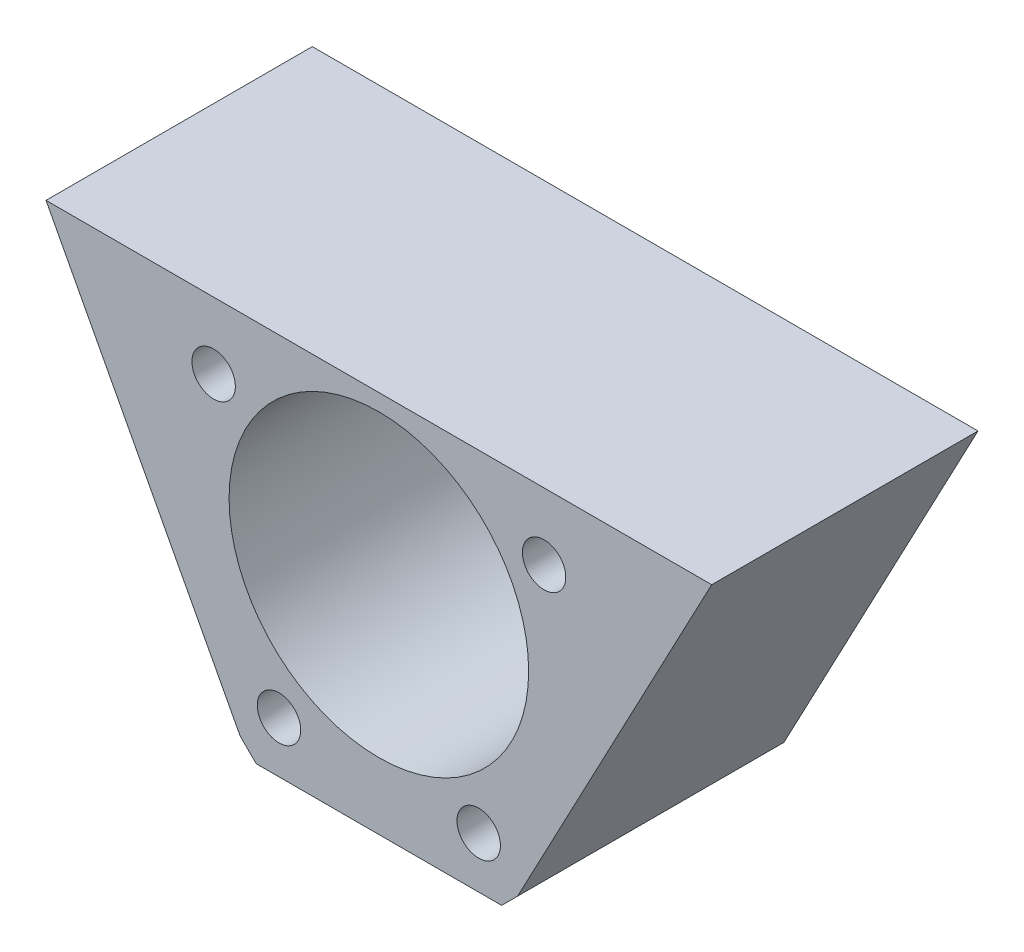
ISO-10303-21;
HEADER;
FILE_DESCRIPTION(('STEP AP214'),'2;1');
FILE_NAME('part.step','',(''),(''),'','','');
FILE_SCHEMA(('AUTOMOTIVE_DESIGN { 1 0 10303 214 1 1 1 1 }'));
ENDSEC;
DATA;
#1=APPLICATION_CONTEXT('core data for automotive mechanical design processes');
#2=APPLICATION_PROTOCOL_DEFINITION('international standard','automotive_design',2000,#1);
#3=PRODUCT_CONTEXT('',#1,'mechanical');
#4=PRODUCT('Part','Part','',(#3));
#5=PRODUCT_RELATED_PRODUCT_CATEGORY('part','',(#4));
#6=PRODUCT_DEFINITION_FORMATION('','',#4);
#7=PRODUCT_DEFINITION_CONTEXT('part definition',#1,'design');
#8=PRODUCT_DEFINITION('design','',#6,#7);
#9=PRODUCT_DEFINITION_SHAPE('','',#8);
#10=(LENGTH_UNIT() NAMED_UNIT(*) SI_UNIT(.MILLI.,.METRE.));
#11=(NAMED_UNIT(*) PLANE_ANGLE_UNIT() SI_UNIT($,.RADIAN.));
#12=(NAMED_UNIT(*) SI_UNIT($,.STERADIAN.) SOLID_ANGLE_UNIT());
#13=UNCERTAINTY_MEASURE_WITH_UNIT(LENGTH_MEASURE(1.E-05),#10,'distance_accuracy_value','');
#14=(GEOMETRIC_REPRESENTATION_CONTEXT(3) GLOBAL_UNCERTAINTY_ASSIGNED_CONTEXT((#13)) GLOBAL_UNIT_ASSIGNED_CONTEXT((#10,
#11,#12)) REPRESENTATION_CONTEXT('',''));
#15=CARTESIAN_POINT('',(0.,0.,0.));
#16=DIRECTION('',(0.,0.,1.));
#17=DIRECTION('',(1.,0.,0.));
#18=AXIS2_PLACEMENT_3D('',#15,#16,#17);
#19=CARTESIAN_POINT('',(-31.75,15.875,25.4));
#20=DIRECTION('',(0.883868107973205,0.46773621594641,0.));
#21=DIRECTION('',(-0.46773621594641,0.883868107973205,0.));
#22=AXIS2_PLACEMENT_3D('',#19,#20,#21);
#23=PLANE('',#22);
#24=DIRECTION('',(0.46773621594641,-0.883868107973205,0.));
#25=VECTOR('',#24,1.);
#26=CARTESIAN_POINT('',(-31.75,15.875,0.));
#27=LINE('',#26,#25);
#28=CARTESIAN_POINT('',(-31.75,15.875,0.));
#29=VERTEX_POINT('',#28);
#30=CARTESIAN_POINT('',(-13.2357534010395,-19.1108564594183,0.));
#31=VERTEX_POINT('',#30);
#32=EDGE_CURVE('E132',#29,#31,#27,.T.);
#33=ORIENTED_EDGE('',*,*,#32,.T.);
#34=DIRECTION('',(0.,0.,-1.));
#35=VECTOR('',#34,1.);
#36=CARTESIAN_POINT('',(-13.2357534010395,-19.1108564594183,25.4));
#37=LINE('',#36,#35);
#38=CARTESIAN_POINT('',(-13.2357534010395,-19.1108564594183,25.4));
#39=VERTEX_POINT('',#38);
#40=EDGE_CURVE('E11',#39,#31,#37,.T.);
#41=ORIENTED_EDGE('',*,*,#40,.F.);
#42=DIRECTION('',(0.46773621594641,-0.883868107973205,0.));
#43=VECTOR('',#42,1.);
#44=CARTESIAN_POINT('',(-31.75,15.875,25.4));
#45=LINE('',#44,#43);
#46=CARTESIAN_POINT('',(-31.75,15.875,25.4));
#47=VERTEX_POINT('',#46);
#48=EDGE_CURVE('E149',#47,#39,#45,.T.);
#49=ORIENTED_EDGE('',*,*,#48,.F.);
#50=DIRECTION('',(0.,0.,-1.));
#51=VECTOR('',#50,1.);
#52=CARTESIAN_POINT('',(-31.75,15.875,25.4));
#53=LINE('',#52,#51);
#54=EDGE_CURVE('E128',#47,#29,#53,.T.);
#55=ORIENTED_EDGE('',*,*,#54,.T.);
#56=EDGE_LOOP('',(#33,#41,#49,#55));
#57=FACE_BOUND('',#56,.T.);
#58=ADVANCED_FACE('F43',(#57),#23,.F.);
#59=CARTESIAN_POINT('',(-13.2357534010395,-19.1108564594183,25.4));
#60=DIRECTION('',(0.707106781186545,0.70710678118655,0.));
#61=DIRECTION('',(-0.70710678118655,0.707106781186545,0.));
#62=AXIS2_PLACEMENT_3D('',#59,#60,#61);
#63=PLANE('',#62);
#64=DIRECTION('',(0.70710678118655,-0.707106781186545,0.));
#65=VECTOR('',#64,1.);
#66=CARTESIAN_POINT('',(-13.2357534010395,-19.1108564594183,0.));
#67=LINE('',#66,#65);
#68=CARTESIAN_POINT('',(-11.7091098604577,-20.6375,0.));
#69=VERTEX_POINT('',#68);
#70=EDGE_CURVE('E136',#31,#69,#67,.T.);
#71=ORIENTED_EDGE('',*,*,#70,.T.);
#72=DIRECTION('',(0.,0.,-1.));
#73=VECTOR('',#72,1.);
#74=CARTESIAN_POINT('',(-11.7091098604577,-20.6375,25.4));
#75=LINE('',#74,#73);
#76=CARTESIAN_POINT('',(-11.7091098604577,-20.6375,25.4));
#77=VERTEX_POINT('',#76);
#78=EDGE_CURVE('E52',#77,#69,#75,.T.);
#79=ORIENTED_EDGE('',*,*,#78,.F.);
#80=DIRECTION('',(0.70710678118655,-0.707106781186545,0.));
#81=VECTOR('',#80,1.);
#82=CARTESIAN_POINT('',(-13.2357534010395,-19.1108564594183,25.4));
#83=LINE('',#82,#81);
#84=EDGE_CURVE('E97',#39,#77,#83,.T.);
#85=ORIENTED_EDGE('',*,*,#84,.F.);
#86=ORIENTED_EDGE('',*,*,#40,.T.);
#87=EDGE_LOOP('',(#71,#79,#85,#86));
#88=FACE_BOUND('',#87,.T.);
#89=ADVANCED_FACE('F178',(#88),#63,.F.);
#90=CARTESIAN_POINT('',(-11.7091098604577,-20.6375,25.4));
#91=DIRECTION('',(0.,1.,0.));
#92=DIRECTION('',(0.,0.,1.));
#93=AXIS2_PLACEMENT_3D('',#90,#91,#92);
#94=PLANE('',#93);
#95=DIRECTION('',(1.,0.,0.));
#96=VECTOR('',#95,1.);
#97=CARTESIAN_POINT('',(-11.7091098604577,-20.6375,0.));
#98=LINE('',#97,#96);
#99=CARTESIAN_POINT('',(11.7091098604578,-20.6375,0.));
#100=VERTEX_POINT('',#99);
#101=EDGE_CURVE('E140',#69,#100,#98,.T.);
#102=ORIENTED_EDGE('',*,*,#101,.T.);
#103=DIRECTION('',(0.,0.,-1.));
#104=VECTOR('',#103,1.);
#105=CARTESIAN_POINT('',(11.7091098604578,-20.6375,25.4));
#106=LINE('',#105,#104);
#107=CARTESIAN_POINT('',(11.7091098604578,-20.6375,25.4));
#108=VERTEX_POINT('',#107);
#109=EDGE_CURVE('E121',#108,#100,#106,.T.);
#110=ORIENTED_EDGE('',*,*,#109,.F.);
#111=DIRECTION('',(1.,0.,0.));
#112=VECTOR('',#111,1.);
#113=CARTESIAN_POINT('',(-11.7091098604577,-20.6375,25.4));
#114=LINE('',#113,#112);
#115=EDGE_CURVE('E110',#77,#108,#114,.T.);
#116=ORIENTED_EDGE('',*,*,#115,.F.);
#117=ORIENTED_EDGE('',*,*,#78,.T.);
#118=EDGE_LOOP('',(#102,#110,#116,#117));
#119=FACE_BOUND('',#118,.T.);
#120=ADVANCED_FACE('F159',(#119),#94,.F.);
#121=CARTESIAN_POINT('',(11.7091098604578,-20.6375,25.4));
#122=DIRECTION('',(-0.707106781186545,0.70710678118655,0.));
#123=DIRECTION('',(-0.70710678118655,-0.707106781186545,0.));
#124=AXIS2_PLACEMENT_3D('',#121,#122,#123);
#125=PLANE('',#124);
#126=DIRECTION('',(0.70710678118655,0.707106781186545,0.));
#127=VECTOR('',#126,1.);
#128=CARTESIAN_POINT('',(11.7091098604578,-20.6375,0.));
#129=LINE('',#128,#127);
#130=CARTESIAN_POINT('',(13.2357534010395,-19.1108564594183,0.));
#131=VERTEX_POINT('',#130);
#132=EDGE_CURVE('E119',#100,#131,#129,.T.);
#133=ORIENTED_EDGE('',*,*,#132,.T.);
#134=DIRECTION('',(0.,0.,-1.));
#135=VECTOR('',#134,1.);
#136=CARTESIAN_POINT('',(13.2357534010395,-19.1108564594183,25.4));
#137=LINE('',#136,#135);
#138=CARTESIAN_POINT('',(13.2357534010395,-19.1108564594183,25.4));
#139=VERTEX_POINT('',#138);
#140=EDGE_CURVE('E116',#139,#131,#137,.T.);
#141=ORIENTED_EDGE('',*,*,#140,.F.);
#142=DIRECTION('',(0.70710678118655,0.707106781186545,0.));
#143=VECTOR('',#142,1.);
#144=CARTESIAN_POINT('',(11.7091098604578,-20.6375,25.4));
#145=LINE('',#144,#143);
#146=EDGE_CURVE('E104',#108,#139,#145,.T.);
#147=ORIENTED_EDGE('',*,*,#146,.F.);
#148=ORIENTED_EDGE('',*,*,#109,.T.);
#149=EDGE_LOOP('',(#133,#141,#147,#148));
#150=FACE_BOUND('',#149,.T.);
#151=ADVANCED_FACE('F117',(#150),#125,.F.);
#152=CARTESIAN_POINT('',(13.2357534010395,-19.1108564594183,25.4));
#153=DIRECTION('',(-0.883868107973205,0.46773621594641,0.));
#154=DIRECTION('',(-0.46773621594641,-0.883868107973205,0.));
#155=AXIS2_PLACEMENT_3D('',#152,#153,#154);
#156=PLANE('',#155);
#157=DIRECTION('',(0.46773621594641,0.883868107973205,0.));
#158=VECTOR('',#157,1.);
#159=CARTESIAN_POINT('',(13.2357534010395,-19.1108564594183,0.));
#160=LINE('',#159,#158);
#161=CARTESIAN_POINT('',(31.75,15.875,0.));
#162=VERTEX_POINT('',#161);
#163=EDGE_CURVE('E83',#131,#162,#160,.T.);
#164=ORIENTED_EDGE('',*,*,#163,.T.);
#165=DIRECTION('',(0.,0.,-1.));
#166=VECTOR('',#165,1.);
#167=CARTESIAN_POINT('',(31.75,15.875,25.4));
#168=LINE('',#167,#166);
#169=CARTESIAN_POINT('',(31.75,15.875,25.4));
#170=VERTEX_POINT('',#169);
#171=EDGE_CURVE('E122',#170,#162,#168,.T.);
#172=ORIENTED_EDGE('',*,*,#171,.F.);
#173=DIRECTION('',(0.46773621594641,0.883868107973205,0.));
#174=VECTOR('',#173,1.);
#175=CARTESIAN_POINT('',(13.2357534010395,-19.1108564594183,25.4));
#176=LINE('',#175,#174);
#177=EDGE_CURVE('E108',#139,#170,#176,.T.);
#178=ORIENTED_EDGE('',*,*,#177,.F.);
#179=ORIENTED_EDGE('',*,*,#140,.T.);
#180=EDGE_LOOP('',(#164,#172,#178,#179));
#181=FACE_BOUND('',#180,.T.);
#182=ADVANCED_FACE('F124',(#181),#156,.F.);
#183=CARTESIAN_POINT('',(-31.75,15.875,25.4));
#184=DIRECTION('',(0.,-1.,0.));
#185=DIRECTION('',(1.,0.,0.));
#186=AXIS2_PLACEMENT_3D('',#183,#184,#185);
#187=PLANE('',#186);
#188=DIRECTION('',(-1.,0.,0.));
#189=VECTOR('',#188,1.);
#190=CARTESIAN_POINT('',(-31.75,15.875,0.));
#191=LINE('',#190,#189);
#192=EDGE_CURVE('E89',#162,#29,#191,.T.);
#193=ORIENTED_EDGE('',*,*,#192,.T.);
#194=ORIENTED_EDGE('',*,*,#54,.F.);
#195=DIRECTION('',(-1.,0.,0.));
#196=VECTOR('',#195,1.);
#197=CARTESIAN_POINT('',(-31.75,15.875,25.4));
#198=LINE('',#197,#196);
#199=EDGE_CURVE('E60',#170,#47,#198,.T.);
#200=ORIENTED_EDGE('',*,*,#199,.F.);
#201=ORIENTED_EDGE('',*,*,#171,.T.);
#202=EDGE_LOOP('',(#193,#194,#200,#201));
#203=FACE_BOUND('',#202,.T.);
#204=ADVANCED_FACE('F166',(#203),#187,.F.);
#205=CARTESIAN_POINT('',(0.,0.,25.4));
#206=DIRECTION('',(0.,0.,1.));
#207=DIRECTION('',(1.,0.,0.));
#208=AXIS2_PLACEMENT_3D('',#205,#206,#207);
#209=PLANE('',#208);
#210=CARTESIAN_POINT('',(-9.525,-15.7602855304084,25.4));
#211=DIRECTION('',(0.,0.,-1.));
#212=DIRECTION('',(-1.,0.,0.));
#213=AXIS2_PLACEMENT_3D('',#210,#211,#212);
#214=CIRCLE('',#213,2.0701);
#215=CARTESIAN_POINT('',(-11.5951,-15.7602855304084,25.4));
#216=VERTEX_POINT('',#215);
#217=EDGE_CURVE('E329',#216,#216,#214,.T.);
#218=ORIENTED_EDGE('',*,*,#217,.T.);
#219=EDGE_LOOP('',(#218));
#220=FACE_BOUND('',#219,.T.);
#221=CARTESIAN_POINT('',(-15.7602855304084,9.525,25.4));
#222=DIRECTION('',(0.,0.,-1.));
#223=DIRECTION('',(-1.,0.,0.));
#224=AXIS2_PLACEMENT_3D('',#221,#222,#223);
#225=CIRCLE('',#224,2.0701);
#226=CARTESIAN_POINT('',(-17.8303855304084,9.525,25.4));
#227=VERTEX_POINT('',#226);
#228=EDGE_CURVE('E338',#227,#227,#225,.T.);
#229=ORIENTED_EDGE('',*,*,#228,.T.);
#230=EDGE_LOOP('',(#229));
#231=FACE_BOUND('',#230,.T.);
#232=CARTESIAN_POINT('',(0.,0.,25.4));
#233=DIRECTION('',(0.,0.,-1.));
#234=DIRECTION('',(-1.,0.,0.));
#235=AXIS2_PLACEMENT_3D('',#232,#233,#234);
#236=CIRCLE('',#235,14.2875);
#237=CARTESIAN_POINT('',(-14.2875,0.,25.4));
#238=VERTEX_POINT('',#237);
#239=EDGE_CURVE('E372',#238,#238,#236,.T.);
#240=ORIENTED_EDGE('',*,*,#239,.T.);
#241=EDGE_LOOP('',(#240));
#242=FACE_BOUND('',#241,.T.);
#243=CARTESIAN_POINT('',(15.7602855304084,9.525,25.4));
#244=DIRECTION('',(0.,0.,-1.));
#245=DIRECTION('',(-1.,0.,0.));
#246=AXIS2_PLACEMENT_3D('',#243,#244,#245);
#247=CIRCLE('',#246,2.0701);
#248=CARTESIAN_POINT('',(13.6901855304084,9.525,25.4));
#249=VERTEX_POINT('',#248);
#250=EDGE_CURVE('E365',#249,#249,#247,.T.);
#251=ORIENTED_EDGE('',*,*,#250,.T.);
#252=EDGE_LOOP('',(#251));
#253=FACE_BOUND('',#252,.T.);
#254=CARTESIAN_POINT('',(9.525,-15.7602855304084,25.4));
#255=DIRECTION('',(0.,0.,-1.));
#256=DIRECTION('',(-1.,0.,0.));
#257=AXIS2_PLACEMENT_3D('',#254,#255,#256);
#258=CIRCLE('',#257,2.0701);
#259=CARTESIAN_POINT('',(7.4549,-15.7602855304084,25.4));
#260=VERTEX_POINT('',#259);
#261=EDGE_CURVE('E137',#260,#260,#258,.T.);
#262=ORIENTED_EDGE('',*,*,#261,.T.);
#263=EDGE_LOOP('',(#262));
#264=FACE_BOUND('',#263,.T.);
#265=ORIENTED_EDGE('',*,*,#48,.T.);
#266=ORIENTED_EDGE('',*,*,#84,.T.);
#267=ORIENTED_EDGE('',*,*,#115,.T.);
#268=ORIENTED_EDGE('',*,*,#146,.T.);
#269=ORIENTED_EDGE('',*,*,#177,.T.);
#270=ORIENTED_EDGE('',*,*,#199,.T.);
#271=EDGE_LOOP('',(#265,#266,#267,#268,#269,#270));
#272=FACE_BOUND('',#271,.T.);
#273=ADVANCED_FACE('F106',(#220,#231,#242,#253,#264,#272),#209,.T.);
#274=CARTESIAN_POINT('',(0.,0.,0.));
#275=DIRECTION('',(0.,0.,1.));
#276=DIRECTION('',(1.,0.,0.));
#277=AXIS2_PLACEMENT_3D('',#274,#275,#276);
#278=PLANE('',#277);
#279=CARTESIAN_POINT('',(-9.525,-15.7602855304084,0.));
#280=DIRECTION('',(0.,0.,-1.));
#281=DIRECTION('',(-1.,0.,0.));
#282=AXIS2_PLACEMENT_3D('',#279,#280,#281);
#283=CIRCLE('',#282,2.0701);
#284=CARTESIAN_POINT('',(-11.5951,-15.7602855304084,0.));
#285=VERTEX_POINT('',#284);
#286=EDGE_CURVE('E326',#285,#285,#283,.T.);
#287=ORIENTED_EDGE('',*,*,#286,.F.);
#288=EDGE_LOOP('',(#287));
#289=FACE_BOUND('',#288,.T.);
#290=CARTESIAN_POINT('',(-15.7602855304084,9.525,0.));
#291=DIRECTION('',(0.,0.,-1.));
#292=DIRECTION('',(-1.,0.,0.));
#293=AXIS2_PLACEMENT_3D('',#290,#291,#292);
#294=CIRCLE('',#293,2.0701);
#295=CARTESIAN_POINT('',(-17.8303855304084,9.525,0.));
#296=VERTEX_POINT('',#295);
#297=EDGE_CURVE('E331',#296,#296,#294,.T.);
#298=ORIENTED_EDGE('',*,*,#297,.F.);
#299=EDGE_LOOP('',(#298));
#300=FACE_BOUND('',#299,.T.);
#301=CARTESIAN_POINT('',(0.,0.,0.));
#302=DIRECTION('',(0.,0.,-1.));
#303=DIRECTION('',(-1.,0.,0.));
#304=AXIS2_PLACEMENT_3D('',#301,#302,#303);
#305=CIRCLE('',#304,14.2875);
#306=CARTESIAN_POINT('',(-14.2875,0.,0.));
#307=VERTEX_POINT('',#306);
#308=EDGE_CURVE('E370',#307,#307,#305,.T.);
#309=ORIENTED_EDGE('',*,*,#308,.F.);
#310=EDGE_LOOP('',(#309));
#311=FACE_BOUND('',#310,.T.);
#312=CARTESIAN_POINT('',(15.7602855304084,9.525,0.));
#313=DIRECTION('',(0.,0.,-1.));
#314=DIRECTION('',(-1.,0.,0.));
#315=AXIS2_PLACEMENT_3D('',#312,#313,#314);
#316=CIRCLE('',#315,2.0701);
#317=CARTESIAN_POINT('',(13.6901855304084,9.525,0.));
#318=VERTEX_POINT('',#317);
#319=EDGE_CURVE('E345',#318,#318,#316,.T.);
#320=ORIENTED_EDGE('',*,*,#319,.F.);
#321=EDGE_LOOP('',(#320));
#322=FACE_BOUND('',#321,.T.);
#323=CARTESIAN_POINT('',(9.525,-15.7602855304084,0.));
#324=DIRECTION('',(0.,0.,-1.));
#325=DIRECTION('',(-1.,0.,0.));
#326=AXIS2_PLACEMENT_3D('',#323,#324,#325);
#327=CIRCLE('',#326,2.0701);
#328=CARTESIAN_POINT('',(7.4549,-15.7602855304084,0.));
#329=VERTEX_POINT('',#328);
#330=EDGE_CURVE('E335',#329,#329,#327,.T.);
#331=ORIENTED_EDGE('',*,*,#330,.F.);
#332=EDGE_LOOP('',(#331));
#333=FACE_BOUND('',#332,.T.);
#334=ORIENTED_EDGE('',*,*,#32,.F.);
#335=ORIENTED_EDGE('',*,*,#192,.F.);
#336=ORIENTED_EDGE('',*,*,#163,.F.);
#337=ORIENTED_EDGE('',*,*,#132,.F.);
#338=ORIENTED_EDGE('',*,*,#101,.F.);
#339=ORIENTED_EDGE('',*,*,#70,.F.);
#340=EDGE_LOOP('',(#334,#335,#336,#337,#338,#339));
#341=FACE_BOUND('',#340,.T.);
#342=ADVANCED_FACE('F162',(#289,#300,#311,#322,#333,#341),#278,.F.);
#343=CARTESIAN_POINT('',(9.525,-15.7602855304084,25.4));
#344=DIRECTION('',(0.,0.,-1.));
#345=DIRECTION('',(-1.,0.,0.));
#346=AXIS2_PLACEMENT_3D('',#343,#344,#345);
#347=CYLINDRICAL_SURFACE('',#346,2.0701);
#348=ORIENTED_EDGE('',*,*,#330,.T.);
#349=EDGE_LOOP('',(#348));
#350=FACE_BOUND('',#349,.T.);
#351=ORIENTED_EDGE('',*,*,#261,.F.);
#352=EDGE_LOOP('',(#351));
#353=FACE_BOUND('',#352,.T.);
#354=ADVANCED_FACE('F218',(#350,#353),#347,.F.);
#355=CARTESIAN_POINT('',(15.7602855304084,9.525,25.4));
#356=DIRECTION('',(0.,0.,-1.));
#357=DIRECTION('',(-1.,0.,0.));
#358=AXIS2_PLACEMENT_3D('',#355,#356,#357);
#359=CYLINDRICAL_SURFACE('',#358,2.0701);
#360=ORIENTED_EDGE('',*,*,#319,.T.);
#361=EDGE_LOOP('',(#360));
#362=FACE_BOUND('',#361,.T.);
#363=ORIENTED_EDGE('',*,*,#250,.F.);
#364=EDGE_LOOP('',(#363));
#365=FACE_BOUND('',#364,.T.);
#366=ADVANCED_FACE('F229',(#362,#365),#359,.F.);
#367=CARTESIAN_POINT('',(0.,0.,25.4));
#368=DIRECTION('',(0.,0.,-1.));
#369=DIRECTION('',(-1.,0.,0.));
#370=AXIS2_PLACEMENT_3D('',#367,#368,#369);
#371=CYLINDRICAL_SURFACE('',#370,14.2875);
#372=ORIENTED_EDGE('',*,*,#308,.T.);
#373=EDGE_LOOP('',(#372));
#374=FACE_BOUND('',#373,.T.);
#375=ORIENTED_EDGE('',*,*,#239,.F.);
#376=EDGE_LOOP('',(#375));
#377=FACE_BOUND('',#376,.T.);
#378=ADVANCED_FACE('F240',(#374,#377),#371,.F.);
#379=CARTESIAN_POINT('',(-15.7602855304084,9.525,25.4));
#380=DIRECTION('',(0.,0.,-1.));
#381=DIRECTION('',(-1.,0.,0.));
#382=AXIS2_PLACEMENT_3D('',#379,#380,#381);
#383=CYLINDRICAL_SURFACE('',#382,2.0701);
#384=ORIENTED_EDGE('',*,*,#297,.T.);
#385=EDGE_LOOP('',(#384));
#386=FACE_BOUND('',#385,.T.);
#387=ORIENTED_EDGE('',*,*,#228,.F.);
#388=EDGE_LOOP('',(#387));
#389=FACE_BOUND('',#388,.T.);
#390=ADVANCED_FACE('F251',(#386,#389),#383,.F.);
#391=CARTESIAN_POINT('',(-9.525,-15.7602855304084,25.4));
#392=DIRECTION('',(0.,0.,-1.));
#393=DIRECTION('',(-1.,0.,0.));
#394=AXIS2_PLACEMENT_3D('',#391,#392,#393);
#395=CYLINDRICAL_SURFACE('',#394,2.0701);
#396=ORIENTED_EDGE('',*,*,#286,.T.);
#397=EDGE_LOOP('',(#396));
#398=FACE_BOUND('',#397,.T.);
#399=ORIENTED_EDGE('',*,*,#217,.F.);
#400=EDGE_LOOP('',(#399));
#401=FACE_BOUND('',#400,.T.);
#402=ADVANCED_FACE('F262',(#398,#401),#395,.F.);
#403=CLOSED_SHELL('',(#58,#89,#120,#151,#182,#204,#273,#342,#354,#366,#378,#390,#402));
#404=MANIFOLD_SOLID_BREP('B2',#403);
#405=ADVANCED_BREP_SHAPE_REPRESENTATION('',(#18,#404),#14);
#406=SHAPE_DEFINITION_REPRESENTATION(#9,#405);
ENDSEC;
END-ISO-10303-21;
